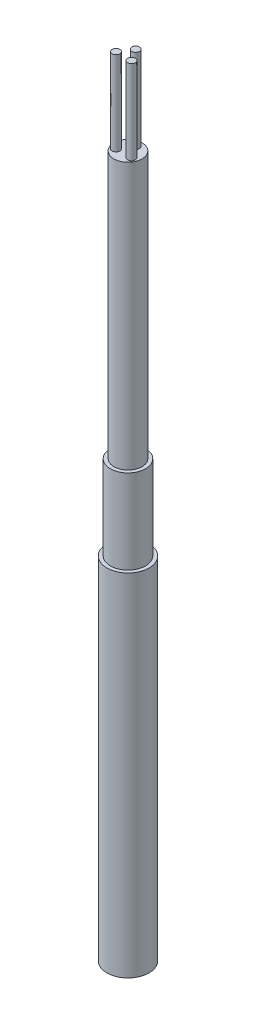
ISO-10303-21;
HEADER;
FILE_DESCRIPTION(('STEP AP214'),'2;1');
FILE_NAME('part.step','',(''),(''),'','','');
FILE_SCHEMA(('AUTOMOTIVE_DESIGN { 1 0 10303 214 1 1 1 1 }'));
ENDSEC;
DATA;
#1=APPLICATION_CONTEXT('core data for automotive mechanical design processes');
#2=APPLICATION_PROTOCOL_DEFINITION('international standard','automotive_design',2000,#1);
#3=PRODUCT_CONTEXT('',#1,'mechanical');
#4=PRODUCT('Part','Part','',(#3));
#5=PRODUCT_RELATED_PRODUCT_CATEGORY('part','',(#4));
#6=PRODUCT_DEFINITION_FORMATION('','',#4);
#7=PRODUCT_DEFINITION_CONTEXT('part definition',#1,'design');
#8=PRODUCT_DEFINITION('design','',#6,#7);
#9=PRODUCT_DEFINITION_SHAPE('','',#8);
#10=(LENGTH_UNIT() NAMED_UNIT(*) SI_UNIT(.MILLI.,.METRE.));
#11=(NAMED_UNIT(*) PLANE_ANGLE_UNIT() SI_UNIT($,.RADIAN.));
#12=(NAMED_UNIT(*) SI_UNIT($,.STERADIAN.) SOLID_ANGLE_UNIT());
#13=UNCERTAINTY_MEASURE_WITH_UNIT(LENGTH_MEASURE(1.E-05),#10,'distance_accuracy_value','');
#14=(GEOMETRIC_REPRESENTATION_CONTEXT(3) GLOBAL_UNCERTAINTY_ASSIGNED_CONTEXT((#13)) GLOBAL_UNIT_ASSIGNED_CONTEXT((#10,
#11,#12)) REPRESENTATION_CONTEXT('',''));
#15=CARTESIAN_POINT('',(0.,0.,0.));
#16=DIRECTION('',(0.,0.,1.));
#17=DIRECTION('',(1.,0.,0.));
#18=AXIS2_PLACEMENT_3D('',#15,#16,#17);
#19=CARTESIAN_POINT('',(0.,112.,-1.1));
#20=DIRECTION('',(0.,-1.,0.));
#21=DIRECTION('',(0.,0.,-1.));
#22=AXIS2_PLACEMENT_3D('',#19,#20,#21);
#23=CYLINDRICAL_SURFACE('',#22,0.55);
#24=CARTESIAN_POINT('',(0.,112.,-1.1));
#25=DIRECTION('',(0.,1.,0.));
#26=DIRECTION('',(0.,0.,1.));
#27=AXIS2_PLACEMENT_3D('',#24,#25,#26);
#28=CIRCLE('',#27,0.55);
#29=CARTESIAN_POINT('',(0.,112.,-0.55));
#30=VERTEX_POINT('',#29);
#31=EDGE_CURVE('E11',#30,#30,#28,.T.);
#32=ORIENTED_EDGE('',*,*,#31,.F.);
#33=EDGE_LOOP('',(#32));
#34=FACE_BOUND('',#33,.T.);
#35=CARTESIAN_POINT('',(0.,100.,-1.1));
#36=DIRECTION('',(0.,1.,0.));
#37=DIRECTION('',(0.,0.,1.));
#38=AXIS2_PLACEMENT_3D('',#35,#36,#37);
#39=CIRCLE('',#38,0.55);
#40=CARTESIAN_POINT('',(0.,100.,-0.55));
#41=VERTEX_POINT('',#40);
#42=EDGE_CURVE('E60',#41,#41,#39,.T.);
#43=ORIENTED_EDGE('',*,*,#42,.T.);
#44=EDGE_LOOP('',(#43));
#45=FACE_BOUND('',#44,.T.);
#46=ADVANCED_FACE('F53',(#34,#45),#23,.T.);
#47=CARTESIAN_POINT('',(0.,112.,-1.1));
#48=DIRECTION('',(0.,1.,0.));
#49=DIRECTION('',(0.,0.,1.));
#50=AXIS2_PLACEMENT_3D('',#47,#48,#49);
#51=PLANE('',#50);
#52=ORIENTED_EDGE('',*,*,#31,.T.);
#53=EDGE_LOOP('',(#52));
#54=FACE_BOUND('',#53,.T.);
#55=ADVANCED_FACE('F66',(#54),#51,.T.);
#56=CARTESIAN_POINT('',(0.,100.,-1.1));
#57=DIRECTION('',(0.,1.,0.));
#58=DIRECTION('',(0.,0.,1.));
#59=AXIS2_PLACEMENT_3D('',#56,#57,#58);
#60=PLANE('',#59);
#61=ORIENTED_EDGE('',*,*,#42,.F.);
#62=EDGE_LOOP('',(#61));
#63=FACE_BOUND('',#62,.T.);
#64=ADVANCED_FACE('F69',(#63),#60,.F.);
#65=CLOSED_SHELL('',(#46,#55,#64));
#66=MANIFOLD_SOLID_BREP('B2',#65);
#67=CARTESIAN_POINT('',(1.1,112.,0.6));
#68=DIRECTION('',(0.,-1.,0.));
#69=DIRECTION('',(0.,0.,-1.));
#70=AXIS2_PLACEMENT_3D('',#67,#68,#69);
#71=CYLINDRICAL_SURFACE('',#70,0.55);
#72=CARTESIAN_POINT('',(1.1,112.,0.6));
#73=DIRECTION('',(0.,1.,0.));
#74=DIRECTION('',(0.,0.,1.));
#75=AXIS2_PLACEMENT_3D('',#72,#73,#74);
#76=CIRCLE('',#75,0.55);
#77=CARTESIAN_POINT('',(1.1,112.,1.15));
#78=VERTEX_POINT('',#77);
#79=EDGE_CURVE('E52',#78,#78,#76,.T.);
#80=ORIENTED_EDGE('',*,*,#79,.F.);
#81=EDGE_LOOP('',(#80));
#82=FACE_BOUND('',#81,.T.);
#83=CARTESIAN_POINT('',(1.1,100.,0.6));
#84=DIRECTION('',(0.,1.,0.));
#85=DIRECTION('',(0.,0.,1.));
#86=AXIS2_PLACEMENT_3D('',#83,#84,#85);
#87=CIRCLE('',#86,0.55);
#88=CARTESIAN_POINT('',(1.1,100.,1.15));
#89=VERTEX_POINT('',#88);
#90=EDGE_CURVE('E120',#89,#89,#87,.T.);
#91=ORIENTED_EDGE('',*,*,#90,.T.);
#92=EDGE_LOOP('',(#91));
#93=FACE_BOUND('',#92,.T.);
#94=ADVANCED_FACE('F113',(#82,#93),#71,.T.);
#95=CARTESIAN_POINT('',(1.1,112.,0.6));
#96=DIRECTION('',(0.,1.,0.));
#97=DIRECTION('',(0.,0.,1.));
#98=AXIS2_PLACEMENT_3D('',#95,#96,#97);
#99=PLANE('',#98);
#100=ORIENTED_EDGE('',*,*,#79,.T.);
#101=EDGE_LOOP('',(#100));
#102=FACE_BOUND('',#101,.T.);
#103=ADVANCED_FACE('F128',(#102),#99,.T.);
#104=CARTESIAN_POINT('',(1.1,100.,0.6));
#105=DIRECTION('',(0.,1.,0.));
#106=DIRECTION('',(0.,0.,1.));
#107=AXIS2_PLACEMENT_3D('',#104,#105,#106);
#108=PLANE('',#107);
#109=ORIENTED_EDGE('',*,*,#90,.F.);
#110=EDGE_LOOP('',(#109));
#111=FACE_BOUND('',#110,.T.);
#112=ADVANCED_FACE('F126',(#111),#108,.F.);
#113=CLOSED_SHELL('',(#94,#103,#112));
#114=MANIFOLD_SOLID_BREP('B6',#113);
#115=CARTESIAN_POINT('',(-1.1,112.,0.6));
#116=DIRECTION('',(0.,-1.,0.));
#117=DIRECTION('',(0.,0.,-1.));
#118=AXIS2_PLACEMENT_3D('',#115,#116,#117);
#119=CYLINDRICAL_SURFACE('',#118,0.55);
#120=CARTESIAN_POINT('',(-1.1,112.,0.6));
#121=DIRECTION('',(0.,1.,0.));
#122=DIRECTION('',(0.,0.,1.));
#123=AXIS2_PLACEMENT_3D('',#120,#121,#122);
#124=CIRCLE('',#123,0.55);
#125=CARTESIAN_POINT('',(-1.1,112.,1.15));
#126=VERTEX_POINT('',#125);
#127=EDGE_CURVE('E111',#126,#126,#124,.T.);
#128=ORIENTED_EDGE('',*,*,#127,.F.);
#129=EDGE_LOOP('',(#128));
#130=FACE_BOUND('',#129,.T.);
#131=CARTESIAN_POINT('',(-1.1,100.,0.6));
#132=DIRECTION('',(0.,1.,0.));
#133=DIRECTION('',(0.,0.,1.));
#134=AXIS2_PLACEMENT_3D('',#131,#132,#133);
#135=CIRCLE('',#134,0.55);
#136=CARTESIAN_POINT('',(-1.1,100.,1.15));
#137=VERTEX_POINT('',#136);
#138=EDGE_CURVE('E176',#137,#137,#135,.T.);
#139=ORIENTED_EDGE('',*,*,#138,.T.);
#140=EDGE_LOOP('',(#139));
#141=FACE_BOUND('',#140,.T.);
#142=ADVANCED_FACE('F177',(#130,#141),#119,.T.);
#143=CARTESIAN_POINT('',(-1.1,112.,0.6));
#144=DIRECTION('',(0.,1.,0.));
#145=DIRECTION('',(0.,0.,1.));
#146=AXIS2_PLACEMENT_3D('',#143,#144,#145);
#147=PLANE('',#146);
#148=ORIENTED_EDGE('',*,*,#127,.T.);
#149=EDGE_LOOP('',(#148));
#150=FACE_BOUND('',#149,.T.);
#151=ADVANCED_FACE('F192',(#150),#147,.T.);
#152=CARTESIAN_POINT('',(-1.1,100.,0.6));
#153=DIRECTION('',(0.,1.,0.));
#154=DIRECTION('',(0.,0.,1.));
#155=AXIS2_PLACEMENT_3D('',#152,#153,#154);
#156=PLANE('',#155);
#157=ORIENTED_EDGE('',*,*,#138,.F.);
#158=EDGE_LOOP('',(#157));
#159=FACE_BOUND('',#158,.T.);
#160=ADVANCED_FACE('F188',(#159),#156,.F.);
#161=CLOSED_SHELL('',(#142,#151,#160));
#162=MANIFOLD_SOLID_BREP('B48',#161);
#163=CARTESIAN_POINT('',(0.,100.,0.));
#164=DIRECTION('',(0.,-1.,0.));
#165=DIRECTION('',(0.,0.,-1.));
#166=AXIS2_PLACEMENT_3D('',#163,#164,#165);
#167=CYLINDRICAL_SURFACE('',#166,2.);
#168=CARTESIAN_POINT('',(0.,100.,0.));
#169=DIRECTION('',(0.,1.,0.));
#170=DIRECTION('',(0.,0.,1.));
#171=AXIS2_PLACEMENT_3D('',#168,#169,#170);
#172=CIRCLE('',#171,2.);
#173=CARTESIAN_POINT('',(0.,100.,2.));
#174=VERTEX_POINT('',#173);
#175=EDGE_CURVE('E172',#174,#174,#172,.T.);
#176=ORIENTED_EDGE('',*,*,#175,.F.);
#177=EDGE_LOOP('',(#176));
#178=FACE_BOUND('',#177,.T.);
#179=CARTESIAN_POINT('',(0.,62.,0.));
#180=DIRECTION('',(0.,1.,0.));
#181=DIRECTION('',(0.,0.,1.));
#182=AXIS2_PLACEMENT_3D('',#179,#180,#181);
#183=CIRCLE('',#182,2.);
#184=CARTESIAN_POINT('',(0.,62.,2.));
#185=VERTEX_POINT('',#184);
#186=EDGE_CURVE('E238',#185,#185,#183,.T.);
#187=ORIENTED_EDGE('',*,*,#186,.T.);
#188=EDGE_LOOP('',(#187));
#189=FACE_BOUND('',#188,.T.);
#190=ADVANCED_FACE('F240',(#178,#189),#167,.T.);
#191=CARTESIAN_POINT('',(0.,100.,0.));
#192=DIRECTION('',(0.,1.,0.));
#193=DIRECTION('',(0.,0.,1.));
#194=AXIS2_PLACEMENT_3D('',#191,#192,#193);
#195=PLANE('',#194);
#196=ORIENTED_EDGE('',*,*,#175,.T.);
#197=EDGE_LOOP('',(#196));
#198=FACE_BOUND('',#197,.T.);
#199=ADVANCED_FACE('F252',(#198),#195,.T.);
#200=CARTESIAN_POINT('',(0.,62.,0.));
#201=DIRECTION('',(0.,1.,0.));
#202=DIRECTION('',(0.,0.,1.));
#203=AXIS2_PLACEMENT_3D('',#200,#201,#202);
#204=PLANE('',#203);
#205=ORIENTED_EDGE('',*,*,#186,.F.);
#206=EDGE_LOOP('',(#205));
#207=FACE_BOUND('',#206,.T.);
#208=ADVANCED_FACE('F248',(#207),#204,.F.);
#209=CLOSED_SHELL('',(#190,#199,#208));
#210=MANIFOLD_SOLID_BREP('B108',#209);
#211=CARTESIAN_POINT('',(0.,62.,0.));
#212=DIRECTION('',(0.,-1.,0.));
#213=DIRECTION('',(0.,0.,-1.));
#214=AXIS2_PLACEMENT_3D('',#211,#212,#213);
#215=CYLINDRICAL_SURFACE('',#214,2.5);
#216=CARTESIAN_POINT('',(0.,62.,0.));
#217=DIRECTION('',(0.,1.,0.));
#218=DIRECTION('',(0.,0.,1.));
#219=AXIS2_PLACEMENT_3D('',#216,#217,#218);
#220=CIRCLE('',#219,2.5);
#221=CARTESIAN_POINT('',(0.,62.,2.5));
#222=VERTEX_POINT('',#221);
#223=EDGE_CURVE('E237',#222,#222,#220,.T.);
#224=ORIENTED_EDGE('',*,*,#223,.F.);
#225=EDGE_LOOP('',(#224));
#226=FACE_BOUND('',#225,.T.);
#227=CARTESIAN_POINT('',(0.,50.,0.));
#228=DIRECTION('',(0.,1.,0.));
#229=DIRECTION('',(0.,0.,1.));
#230=AXIS2_PLACEMENT_3D('',#227,#228,#229);
#231=CIRCLE('',#230,2.5);
#232=CARTESIAN_POINT('',(0.,50.,2.5));
#233=VERTEX_POINT('',#232);
#234=EDGE_CURVE('E297',#233,#233,#231,.T.);
#235=ORIENTED_EDGE('',*,*,#234,.T.);
#236=EDGE_LOOP('',(#235));
#237=FACE_BOUND('',#236,.T.);
#238=ADVANCED_FACE('F296',(#226,#237),#215,.T.);
#239=CARTESIAN_POINT('',(0.,62.,0.));
#240=DIRECTION('',(0.,1.,0.));
#241=DIRECTION('',(0.,0.,1.));
#242=AXIS2_PLACEMENT_3D('',#239,#240,#241);
#243=PLANE('',#242);
#244=ORIENTED_EDGE('',*,*,#223,.T.);
#245=EDGE_LOOP('',(#244));
#246=FACE_BOUND('',#245,.T.);
#247=ADVANCED_FACE('F315',(#246),#243,.T.);
#248=CARTESIAN_POINT('',(0.,50.,0.));
#249=DIRECTION('',(0.,1.,0.));
#250=DIRECTION('',(0.,0.,1.));
#251=AXIS2_PLACEMENT_3D('',#248,#249,#250);
#252=PLANE('',#251);
#253=ORIENTED_EDGE('',*,*,#234,.F.);
#254=EDGE_LOOP('',(#253));
#255=FACE_BOUND('',#254,.T.);
#256=ADVANCED_FACE('F309',(#255),#252,.F.);
#257=CLOSED_SHELL('',(#238,#247,#256));
#258=MANIFOLD_SOLID_BREP('B168',#257);
#259=CARTESIAN_POINT('',(0.,50.,0.));
#260=DIRECTION('',(0.,-1.,0.));
#261=DIRECTION('',(0.,0.,-1.));
#262=AXIS2_PLACEMENT_3D('',#259,#260,#261);
#263=CYLINDRICAL_SURFACE('',#262,3.);
#264=CARTESIAN_POINT('',(0.,50.,0.));
#265=DIRECTION('',(0.,1.,0.));
#266=DIRECTION('',(0.,0.,1.));
#267=AXIS2_PLACEMENT_3D('',#264,#265,#266);
#268=CIRCLE('',#267,3.);
#269=CARTESIAN_POINT('',(0.,50.,3.));
#270=VERTEX_POINT('',#269);
#271=EDGE_CURVE('E299',#270,#270,#268,.T.);
#272=ORIENTED_EDGE('',*,*,#271,.F.);
#273=EDGE_LOOP('',(#272));
#274=FACE_BOUND('',#273,.T.);
#275=CARTESIAN_POINT('',(0.,0.,0.));
#276=DIRECTION('',(0.,1.,0.));
#277=DIRECTION('',(0.,0.,1.));
#278=AXIS2_PLACEMENT_3D('',#275,#276,#277);
#279=CIRCLE('',#278,3.);
#280=CARTESIAN_POINT('',(0.,0.,3.));
#281=VERTEX_POINT('',#280);
#282=EDGE_CURVE('E355',#281,#281,#279,.T.);
#283=ORIENTED_EDGE('',*,*,#282,.T.);
#284=EDGE_LOOP('',(#283));
#285=FACE_BOUND('',#284,.T.);
#286=ADVANCED_FACE('F348',(#274,#285),#263,.T.);
#287=CARTESIAN_POINT('',(0.,50.,0.));
#288=DIRECTION('',(0.,1.,0.));
#289=DIRECTION('',(0.,0.,1.));
#290=AXIS2_PLACEMENT_3D('',#287,#288,#289);
#291=PLANE('',#290);
#292=ORIENTED_EDGE('',*,*,#271,.T.);
#293=EDGE_LOOP('',(#292));
#294=FACE_BOUND('',#293,.T.);
#295=ADVANCED_FACE('F364',(#294),#291,.T.);
#296=CARTESIAN_POINT('',(0.,0.,0.));
#297=DIRECTION('',(0.,1.,0.));
#298=DIRECTION('',(0.,0.,1.));
#299=AXIS2_PLACEMENT_3D('',#296,#297,#298);
#300=PLANE('',#299);
#301=ORIENTED_EDGE('',*,*,#282,.F.);
#302=EDGE_LOOP('',(#301));
#303=FACE_BOUND('',#302,.T.);
#304=ADVANCED_FACE('F361',(#303),#300,.F.);
#305=CLOSED_SHELL('',(#286,#295,#304));
#306=MANIFOLD_SOLID_BREP('B232',#305);
#307=ADVANCED_BREP_SHAPE_REPRESENTATION('',(#18,#66,#114,#162,#210,#258,#306),#14);
#308=SHAPE_DEFINITION_REPRESENTATION(#9,#307);
ENDSEC;
END-ISO-10303-21;
